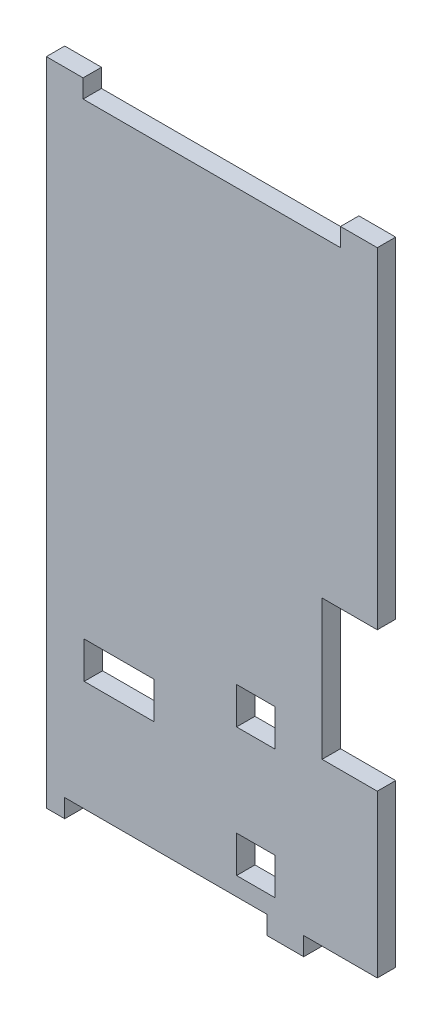
ISO-10303-21;
HEADER;
FILE_DESCRIPTION(('STEP AP214'),'2;1');
FILE_NAME('part.step','',(''),(''),'','','');
FILE_SCHEMA(('AUTOMOTIVE_DESIGN { 1 0 10303 214 1 1 1 1 }'));
ENDSEC;
DATA;
#1=APPLICATION_CONTEXT('core data for automotive mechanical design processes');
#2=APPLICATION_PROTOCOL_DEFINITION('international standard','automotive_design',2000,#1);
#3=PRODUCT_CONTEXT('',#1,'mechanical');
#4=PRODUCT('Part','Part','',(#3));
#5=PRODUCT_RELATED_PRODUCT_CATEGORY('part','',(#4));
#6=PRODUCT_DEFINITION_FORMATION('','',#4);
#7=PRODUCT_DEFINITION_CONTEXT('part definition',#1,'design');
#8=PRODUCT_DEFINITION('design','',#6,#7);
#9=PRODUCT_DEFINITION_SHAPE('','',#8);
#10=(LENGTH_UNIT() NAMED_UNIT(*) SI_UNIT(.MILLI.,.METRE.));
#11=(NAMED_UNIT(*) PLANE_ANGLE_UNIT() SI_UNIT($,.RADIAN.));
#12=(NAMED_UNIT(*) SI_UNIT($,.STERADIAN.) SOLID_ANGLE_UNIT());
#13=UNCERTAINTY_MEASURE_WITH_UNIT(LENGTH_MEASURE(1.E-05),#10,'distance_accuracy_value','');
#14=(GEOMETRIC_REPRESENTATION_CONTEXT(3) GLOBAL_UNCERTAINTY_ASSIGNED_CONTEXT((#13)) GLOBAL_UNIT_ASSIGNED_CONTEXT((#10,
#11,#12)) REPRESENTATION_CONTEXT('',''));
#15=CARTESIAN_POINT('',(0.,0.,0.));
#16=DIRECTION('',(0.,0.,1.));
#17=DIRECTION('',(1.,0.,0.));
#18=AXIS2_PLACEMENT_3D('',#15,#16,#17);
#19=CARTESIAN_POINT('',(0.,0.,5.));
#20=DIRECTION('',(0.,0.,1.));
#21=DIRECTION('',(1.,0.,0.));
#22=AXIS2_PLACEMENT_3D('',#19,#20,#21);
#23=PLANE('',#22);
#24=DIRECTION('',(1.,0.,0.));
#25=VECTOR('',#24,1.);
#26=CARTESIAN_POINT('',(51.7344095157548,5.00000000000664,5.));
#27=LINE('',#26,#25);
#28=CARTESIAN_POINT('',(51.7344095157548,5.00000000000664,5.));
#29=VERTEX_POINT('',#28);
#30=CARTESIAN_POINT('',(62.2002807221094,5.00000000000664,5.));
#31=VERTEX_POINT('',#30);
#32=EDGE_CURVE('E268',#29,#31,#27,.T.);
#33=ORIENTED_EDGE('',*,*,#32,.F.);
#34=DIRECTION('',(0.,-1.,0.));
#35=VECTOR('',#34,1.);
#36=CARTESIAN_POINT('',(51.7344095157548,15.0000000000066,5.));
#37=LINE('',#36,#35);
#38=CARTESIAN_POINT('',(51.7344095157548,15.0000000000066,5.));
#39=VERTEX_POINT('',#38);
#40=EDGE_CURVE('E266',#39,#29,#37,.T.);
#41=ORIENTED_EDGE('',*,*,#40,.F.);
#42=DIRECTION('',(-1.,0.,0.));
#43=VECTOR('',#42,1.);
#44=CARTESIAN_POINT('',(51.7344095157548,15.0000000000066,5.));
#45=LINE('',#44,#43);
#46=CARTESIAN_POINT('',(62.2002807221094,15.0000000000066,5.));
#47=VERTEX_POINT('',#46);
#48=EDGE_CURVE('E274',#47,#39,#45,.T.);
#49=ORIENTED_EDGE('',*,*,#48,.F.);
#50=DIRECTION('',(0.,1.,0.));
#51=VECTOR('',#50,1.);
#52=CARTESIAN_POINT('',(62.2002807221094,15.0000000000066,5.));
#53=LINE('',#52,#51);
#54=EDGE_CURVE('E271',#31,#47,#53,.T.);
#55=ORIENTED_EDGE('',*,*,#54,.F.);
#56=EDGE_LOOP('',(#33,#41,#49,#55));
#57=FACE_BOUND('',#56,.T.);
#58=DIRECTION('',(0.,-1.,0.));
#59=VECTOR('',#58,1.);
#60=CARTESIAN_POINT('',(0.,0.,5.));
#61=LINE('',#60,#59);
#62=CARTESIAN_POINT('',(0.,172.,5.));
#63=VERTEX_POINT('',#62);
#64=CARTESIAN_POINT('',(0.,-5.,5.));
#65=VERTEX_POINT('',#64);
#66=EDGE_CURVE('E328',#63,#65,#61,.T.);
#67=ORIENTED_EDGE('',*,*,#66,.T.);
#68=DIRECTION('',(1.,0.,0.));
#69=VECTOR('',#68,1.);
#70=CARTESIAN_POINT('',(0.,-5.,5.));
#71=LINE('',#70,#69);
#72=CARTESIAN_POINT('',(5.,-5.,5.));
#73=VERTEX_POINT('',#72);
#74=EDGE_CURVE('E331',#65,#73,#71,.T.);
#75=ORIENTED_EDGE('',*,*,#74,.T.);
#76=DIRECTION('',(0.,1.,0.));
#77=VECTOR('',#76,1.);
#78=CARTESIAN_POINT('',(5.,0.,5.));
#79=LINE('',#78,#77);
#80=CARTESIAN_POINT('',(5.,0.,5.));
#81=VERTEX_POINT('',#80);
#82=EDGE_CURVE('E334',#73,#81,#79,.T.);
#83=ORIENTED_EDGE('',*,*,#82,.T.);
#84=DIRECTION('',(1.,0.,0.));
#85=VECTOR('',#84,1.);
#86=CARTESIAN_POINT('',(5.,0.,5.));
#87=LINE('',#86,#85);
#88=CARTESIAN_POINT('',(60.,0.,5.));
#89=VERTEX_POINT('',#88);
#90=EDGE_CURVE('E336',#81,#89,#87,.T.);
#91=ORIENTED_EDGE('',*,*,#90,.T.);
#92=DIRECTION('',(0.,-1.,0.));
#93=VECTOR('',#92,1.);
#94=CARTESIAN_POINT('',(60.,0.,5.));
#95=LINE('',#94,#93);
#96=CARTESIAN_POINT('',(60.,-5.,5.));
#97=VERTEX_POINT('',#96);
#98=EDGE_CURVE('E338',#89,#97,#95,.T.);
#99=ORIENTED_EDGE('',*,*,#98,.T.);
#100=DIRECTION('',(1.,0.,0.));
#101=VECTOR('',#100,1.);
#102=CARTESIAN_POINT('',(60.,-5.,5.));
#103=LINE('',#102,#101);
#104=CARTESIAN_POINT('',(70.,-5.,5.));
#105=VERTEX_POINT('',#104);
#106=EDGE_CURVE('E340',#97,#105,#103,.T.);
#107=ORIENTED_EDGE('',*,*,#106,.T.);
#108=DIRECTION('',(0.,1.,0.));
#109=VECTOR('',#108,1.);
#110=CARTESIAN_POINT('',(70.,0.,5.));
#111=LINE('',#110,#109);
#112=CARTESIAN_POINT('',(70.,0.,5.));
#113=VERTEX_POINT('',#112);
#114=EDGE_CURVE('E342',#105,#113,#111,.T.);
#115=ORIENTED_EDGE('',*,*,#114,.T.);
#116=DIRECTION('',(1.,0.,0.));
#117=VECTOR('',#116,1.);
#118=CARTESIAN_POINT('',(70.,0.,5.));
#119=LINE('',#118,#117);
#120=CARTESIAN_POINT('',(90.,0.,5.));
#121=VERTEX_POINT('',#120);
#122=EDGE_CURVE('E344',#113,#121,#119,.T.);
#123=ORIENTED_EDGE('',*,*,#122,.T.);
#124=DIRECTION('',(0.,1.,0.));
#125=VECTOR('',#124,1.);
#126=CARTESIAN_POINT('',(90.,0.,5.));
#127=LINE('',#126,#125);
#128=CARTESIAN_POINT('',(90.,44.,5.));
#129=VERTEX_POINT('',#128);
#130=EDGE_CURVE('E346',#121,#129,#127,.T.);
#131=ORIENTED_EDGE('',*,*,#130,.T.);
#132=DIRECTION('',(-1.,0.,0.));
#133=VECTOR('',#132,1.);
#134=CARTESIAN_POINT('',(90.,44.,5.));
#135=LINE('',#134,#133);
#136=CARTESIAN_POINT('',(75.,44.,5.));
#137=VERTEX_POINT('',#136);
#138=EDGE_CURVE('E348',#129,#137,#135,.T.);
#139=ORIENTED_EDGE('',*,*,#138,.T.);
#140=DIRECTION('',(0.,1.,0.));
#141=VECTOR('',#140,1.);
#142=CARTESIAN_POINT('',(75.,82.,5.));
#143=LINE('',#142,#141);
#144=CARTESIAN_POINT('',(75.,82.,5.));
#145=VERTEX_POINT('',#144);
#146=EDGE_CURVE('E350',#137,#145,#143,.T.);
#147=ORIENTED_EDGE('',*,*,#146,.T.);
#148=DIRECTION('',(1.,0.,0.));
#149=VECTOR('',#148,1.);
#150=CARTESIAN_POINT('',(90.,82.,5.));
#151=LINE('',#150,#149);
#152=CARTESIAN_POINT('',(90.,82.,5.));
#153=VERTEX_POINT('',#152);
#154=EDGE_CURVE('E352',#145,#153,#151,.T.);
#155=ORIENTED_EDGE('',*,*,#154,.T.);
#156=DIRECTION('',(0.,1.,0.));
#157=VECTOR('',#156,1.);
#158=CARTESIAN_POINT('',(90.,82.,5.));
#159=LINE('',#158,#157);
#160=CARTESIAN_POINT('',(90.,172.,5.));
#161=VERTEX_POINT('',#160);
#162=EDGE_CURVE('E354',#153,#161,#159,.T.);
#163=ORIENTED_EDGE('',*,*,#162,.T.);
#164=DIRECTION('',(-1.,0.,0.));
#165=VECTOR('',#164,1.);
#166=CARTESIAN_POINT('',(90.,172.,5.));
#167=LINE('',#166,#165);
#168=CARTESIAN_POINT('',(80.,172.,5.));
#169=VERTEX_POINT('',#168);
#170=EDGE_CURVE('E356',#161,#169,#167,.T.);
#171=ORIENTED_EDGE('',*,*,#170,.T.);
#172=DIRECTION('',(0.,-1.,0.));
#173=VECTOR('',#172,1.);
#174=CARTESIAN_POINT('',(80.,167.,5.));
#175=LINE('',#174,#173);
#176=CARTESIAN_POINT('',(80.,167.,5.));
#177=VERTEX_POINT('',#176);
#178=EDGE_CURVE('E358',#169,#177,#175,.T.);
#179=ORIENTED_EDGE('',*,*,#178,.T.);
#180=DIRECTION('',(-1.,0.,0.));
#181=VECTOR('',#180,1.);
#182=CARTESIAN_POINT('',(10.,167.,5.));
#183=LINE('',#182,#181);
#184=CARTESIAN_POINT('',(10.,167.,5.));
#185=VERTEX_POINT('',#184);
#186=EDGE_CURVE('E360',#177,#185,#183,.T.);
#187=ORIENTED_EDGE('',*,*,#186,.T.);
#188=DIRECTION('',(0.,1.,0.));
#189=VECTOR('',#188,1.);
#190=CARTESIAN_POINT('',(10.,167.,5.));
#191=LINE('',#190,#189);
#192=CARTESIAN_POINT('',(10.,172.,5.));
#193=VERTEX_POINT('',#192);
#194=EDGE_CURVE('E362',#185,#193,#191,.T.);
#195=ORIENTED_EDGE('',*,*,#194,.T.);
#196=DIRECTION('',(-1.,0.,0.));
#197=VECTOR('',#196,1.);
#198=CARTESIAN_POINT('',(0.,172.,5.));
#199=LINE('',#198,#197);
#200=EDGE_CURVE('E364',#193,#63,#199,.T.);
#201=ORIENTED_EDGE('',*,*,#200,.T.);
#202=EDGE_LOOP('',(#67,#75,#83,#91,#99,#107,#115,#123,#131,#139,#147,#155,#163,#171,#179,#187,
#195,#201));
#203=FACE_BOUND('',#202,.T.);
#204=DIRECTION('',(1.,0.,0.));
#205=VECTOR('',#204,1.);
#206=CARTESIAN_POINT('',(51.7344095157548,40.0000000000066,5.));
#207=LINE('',#206,#205);
#208=CARTESIAN_POINT('',(51.7344095157548,40.0000000000066,5.));
#209=VERTEX_POINT('',#208);
#210=CARTESIAN_POINT('',(62.2002807221094,40.0000000000066,5.));
#211=VERTEX_POINT('',#210);
#212=EDGE_CURVE('E299',#209,#211,#207,.T.);
#213=ORIENTED_EDGE('',*,*,#212,.F.);
#214=DIRECTION('',(0.,-1.,0.));
#215=VECTOR('',#214,1.);
#216=CARTESIAN_POINT('',(51.7344095157548,50.0000000000067,5.));
#217=LINE('',#216,#215);
#218=CARTESIAN_POINT('',(51.7344095157548,50.0000000000067,5.));
#219=VERTEX_POINT('',#218);
#220=EDGE_CURVE('E297',#219,#209,#217,.T.);
#221=ORIENTED_EDGE('',*,*,#220,.F.);
#222=DIRECTION('',(-1.,0.,0.));
#223=VECTOR('',#222,1.);
#224=CARTESIAN_POINT('',(51.7344095157548,50.0000000000067,5.));
#225=LINE('',#224,#223);
#226=CARTESIAN_POINT('',(62.2002807221094,50.0000000000067,5.));
#227=VERTEX_POINT('',#226);
#228=EDGE_CURVE('E305',#227,#219,#225,.T.);
#229=ORIENTED_EDGE('',*,*,#228,.F.);
#230=DIRECTION('',(0.,1.,0.));
#231=VECTOR('',#230,1.);
#232=CARTESIAN_POINT('',(62.2002807221094,50.0000000000067,5.));
#233=LINE('',#232,#231);
#234=EDGE_CURVE('E302',#211,#227,#233,.T.);
#235=ORIENTED_EDGE('',*,*,#234,.F.);
#236=EDGE_LOOP('',(#213,#221,#229,#235));
#237=FACE_BOUND('',#236,.T.);
#238=DIRECTION('',(-1.,0.,0.));
#239=VECTOR('',#238,1.);
#240=CARTESIAN_POINT('',(29.3072899526297,40.,5.));
#241=LINE('',#240,#239);
#242=CARTESIAN_POINT('',(29.3072899526297,40.,5.));
#243=VERTEX_POINT('',#242);
#244=CARTESIAN_POINT('',(10.2916743036235,40.,5.));
#245=VERTEX_POINT('',#244);
#246=EDGE_CURVE('E238',#243,#245,#241,.T.);
#247=ORIENTED_EDGE('',*,*,#246,.F.);
#248=DIRECTION('',(0.,1.,0.));
#249=VECTOR('',#248,1.);
#250=CARTESIAN_POINT('',(29.3072899526297,40.,5.));
#251=LINE('',#250,#249);
#252=CARTESIAN_POINT('',(29.3072899526297,30.,5.));
#253=VERTEX_POINT('',#252);
#254=EDGE_CURVE('E230',#253,#243,#251,.T.);
#255=ORIENTED_EDGE('',*,*,#254,.F.);
#256=DIRECTION('',(1.,0.,0.));
#257=VECTOR('',#256,1.);
#258=CARTESIAN_POINT('',(29.3072899526297,30.,5.));
#259=LINE('',#258,#257);
#260=CARTESIAN_POINT('',(10.2916743036235,30.,5.));
#261=VERTEX_POINT('',#260);
#262=EDGE_CURVE('E252',#261,#253,#259,.T.);
#263=ORIENTED_EDGE('',*,*,#262,.F.);
#264=DIRECTION('',(0.,-1.,0.));
#265=VECTOR('',#264,1.);
#266=CARTESIAN_POINT('',(10.2916743036235,40.,5.));
#267=LINE('',#266,#265);
#268=EDGE_CURVE('E250',#245,#261,#267,.T.);
#269=ORIENTED_EDGE('',*,*,#268,.F.);
#270=EDGE_LOOP('',(#247,#255,#263,#269));
#271=FACE_BOUND('',#270,.T.);
#272=ADVANCED_FACE('F33',(#57,#203,#237,#271),#23,.T.);
#273=CARTESIAN_POINT('',(0.,0.,0.));
#274=DIRECTION('',(0.,0.,1.));
#275=DIRECTION('',(1.,0.,0.));
#276=AXIS2_PLACEMENT_3D('',#273,#274,#275);
#277=PLANE('',#276);
#278=DIRECTION('',(0.,-1.,0.));
#279=VECTOR('',#278,1.);
#280=CARTESIAN_POINT('',(51.7344095157548,15.0000000000066,0.));
#281=LINE('',#280,#279);
#282=CARTESIAN_POINT('',(51.7344095157548,15.0000000000066,0.));
#283=VERTEX_POINT('',#282);
#284=CARTESIAN_POINT('',(51.7344095157548,5.00000000000664,0.));
#285=VERTEX_POINT('',#284);
#286=EDGE_CURVE('E246',#283,#285,#281,.T.);
#287=ORIENTED_EDGE('',*,*,#286,.T.);
#288=DIRECTION('',(1.,0.,0.));
#289=VECTOR('',#288,1.);
#290=CARTESIAN_POINT('',(51.7344095157548,5.00000000000664,0.));
#291=LINE('',#290,#289);
#292=CARTESIAN_POINT('',(62.2002807221094,5.00000000000664,0.));
#293=VERTEX_POINT('',#292);
#294=EDGE_CURVE('E279',#285,#293,#291,.T.);
#295=ORIENTED_EDGE('',*,*,#294,.T.);
#296=DIRECTION('',(0.,1.,0.));
#297=VECTOR('',#296,1.);
#298=CARTESIAN_POINT('',(62.2002807221094,15.0000000000066,0.));
#299=LINE('',#298,#297);
#300=CARTESIAN_POINT('',(62.2002807221094,15.0000000000066,0.));
#301=VERTEX_POINT('',#300);
#302=EDGE_CURVE('E282',#293,#301,#299,.T.);
#303=ORIENTED_EDGE('',*,*,#302,.T.);
#304=DIRECTION('',(-1.,0.,0.));
#305=VECTOR('',#304,1.);
#306=CARTESIAN_POINT('',(51.7344095157548,15.0000000000066,0.));
#307=LINE('',#306,#305);
#308=EDGE_CURVE('E269',#301,#283,#307,.T.);
#309=ORIENTED_EDGE('',*,*,#308,.T.);
#310=EDGE_LOOP('',(#287,#295,#303,#309));
#311=FACE_BOUND('',#310,.T.);
#312=DIRECTION('',(1.,0.,0.));
#313=VECTOR('',#312,1.);
#314=CARTESIAN_POINT('',(0.,-5.,0.));
#315=LINE('',#314,#313);
#316=CARTESIAN_POINT('',(0.,-5.,0.));
#317=VERTEX_POINT('',#316);
#318=CARTESIAN_POINT('',(5.,-5.,0.));
#319=VERTEX_POINT('',#318);
#320=EDGE_CURVE('E327',#317,#319,#315,.T.);
#321=ORIENTED_EDGE('',*,*,#320,.F.);
#322=DIRECTION('',(0.,-1.,0.));
#323=VECTOR('',#322,1.);
#324=CARTESIAN_POINT('',(0.,0.,0.));
#325=LINE('',#324,#323);
#326=CARTESIAN_POINT('',(0.,172.,0.));
#327=VERTEX_POINT('',#326);
#328=EDGE_CURVE('E332',#327,#317,#325,.T.);
#329=ORIENTED_EDGE('',*,*,#328,.F.);
#330=DIRECTION('',(-1.,0.,0.));
#331=VECTOR('',#330,1.);
#332=CARTESIAN_POINT('',(0.,172.,0.));
#333=LINE('',#332,#331);
#334=CARTESIAN_POINT('',(10.,172.,0.));
#335=VERTEX_POINT('',#334);
#336=EDGE_CURVE('E400',#335,#327,#333,.T.);
#337=ORIENTED_EDGE('',*,*,#336,.F.);
#338=DIRECTION('',(0.,1.,0.));
#339=VECTOR('',#338,1.);
#340=CARTESIAN_POINT('',(10.,167.,0.));
#341=LINE('',#340,#339);
#342=CARTESIAN_POINT('',(10.,167.,0.));
#343=VERTEX_POINT('',#342);
#344=EDGE_CURVE('E398',#343,#335,#341,.T.);
#345=ORIENTED_EDGE('',*,*,#344,.F.);
#346=DIRECTION('',(-1.,0.,0.));
#347=VECTOR('',#346,1.);
#348=CARTESIAN_POINT('',(10.,167.,0.));
#349=LINE('',#348,#347);
#350=CARTESIAN_POINT('',(80.,167.,0.));
#351=VERTEX_POINT('',#350);
#352=EDGE_CURVE('E396',#351,#343,#349,.T.);
#353=ORIENTED_EDGE('',*,*,#352,.F.);
#354=DIRECTION('',(0.,-1.,0.));
#355=VECTOR('',#354,1.);
#356=CARTESIAN_POINT('',(80.,167.,0.));
#357=LINE('',#356,#355);
#358=CARTESIAN_POINT('',(80.,172.,0.));
#359=VERTEX_POINT('',#358);
#360=EDGE_CURVE('E394',#359,#351,#357,.T.);
#361=ORIENTED_EDGE('',*,*,#360,.F.);
#362=DIRECTION('',(-1.,0.,0.));
#363=VECTOR('',#362,1.);
#364=CARTESIAN_POINT('',(90.,172.,0.));
#365=LINE('',#364,#363);
#366=CARTESIAN_POINT('',(90.,172.,0.));
#367=VERTEX_POINT('',#366);
#368=EDGE_CURVE('E392',#367,#359,#365,.T.);
#369=ORIENTED_EDGE('',*,*,#368,.F.);
#370=DIRECTION('',(0.,1.,0.));
#371=VECTOR('',#370,1.);
#372=CARTESIAN_POINT('',(90.,167.,0.));
#373=LINE('',#372,#371);
#374=CARTESIAN_POINT('',(90.,82.,0.));
#375=VERTEX_POINT('',#374);
#376=EDGE_CURVE('E390',#375,#367,#373,.T.);
#377=ORIENTED_EDGE('',*,*,#376,.F.);
#378=DIRECTION('',(1.,0.,0.));
#379=VECTOR('',#378,1.);
#380=CARTESIAN_POINT('',(90.,82.,0.));
#381=LINE('',#380,#379);
#382=CARTESIAN_POINT('',(75.,82.,0.));
#383=VERTEX_POINT('',#382);
#384=EDGE_CURVE('E387',#383,#375,#381,.T.);
#385=ORIENTED_EDGE('',*,*,#384,.F.);
#386=DIRECTION('',(0.,1.,0.));
#387=VECTOR('',#386,1.);
#388=CARTESIAN_POINT('',(75.,82.,0.));
#389=LINE('',#388,#387);
#390=CARTESIAN_POINT('',(75.,44.,0.));
#391=VERTEX_POINT('',#390);
#392=EDGE_CURVE('E385',#391,#383,#389,.T.);
#393=ORIENTED_EDGE('',*,*,#392,.F.);
#394=DIRECTION('',(-1.,0.,0.));
#395=VECTOR('',#394,1.);
#396=CARTESIAN_POINT('',(90.,44.,0.));
#397=LINE('',#396,#395);
#398=CARTESIAN_POINT('',(90.,44.,0.));
#399=VERTEX_POINT('',#398);
#400=EDGE_CURVE('E383',#399,#391,#397,.T.);
#401=ORIENTED_EDGE('',*,*,#400,.F.);
#402=DIRECTION('',(0.,1.,0.));
#403=VECTOR('',#402,1.);
#404=CARTESIAN_POINT('',(90.,0.,0.));
#405=LINE('',#404,#403);
#406=CARTESIAN_POINT('',(90.,0.,0.));
#407=VERTEX_POINT('',#406);
#408=EDGE_CURVE('E381',#407,#399,#405,.T.);
#409=ORIENTED_EDGE('',*,*,#408,.F.);
#410=DIRECTION('',(1.,0.,0.));
#411=VECTOR('',#410,1.);
#412=CARTESIAN_POINT('',(70.,0.,0.));
#413=LINE('',#412,#411);
#414=CARTESIAN_POINT('',(70.,0.,0.));
#415=VERTEX_POINT('',#414);
#416=EDGE_CURVE('E379',#415,#407,#413,.T.);
#417=ORIENTED_EDGE('',*,*,#416,.F.);
#418=DIRECTION('',(0.,1.,0.));
#419=VECTOR('',#418,1.);
#420=CARTESIAN_POINT('',(70.,0.,0.));
#421=LINE('',#420,#419);
#422=CARTESIAN_POINT('',(70.,-5.,0.));
#423=VERTEX_POINT('',#422);
#424=EDGE_CURVE('E377',#423,#415,#421,.T.);
#425=ORIENTED_EDGE('',*,*,#424,.F.);
#426=DIRECTION('',(1.,0.,0.));
#427=VECTOR('',#426,1.);
#428=CARTESIAN_POINT('',(60.,-5.,0.));
#429=LINE('',#428,#427);
#430=CARTESIAN_POINT('',(60.,-5.,0.));
#431=VERTEX_POINT('',#430);
#432=EDGE_CURVE('E375',#431,#423,#429,.T.);
#433=ORIENTED_EDGE('',*,*,#432,.F.);
#434=DIRECTION('',(0.,-1.,0.));
#435=VECTOR('',#434,1.);
#436=CARTESIAN_POINT('',(60.,0.,0.));
#437=LINE('',#436,#435);
#438=CARTESIAN_POINT('',(60.,0.,0.));
#439=VERTEX_POINT('',#438);
#440=EDGE_CURVE('E373',#439,#431,#437,.T.);
#441=ORIENTED_EDGE('',*,*,#440,.F.);
#442=DIRECTION('',(1.,0.,0.));
#443=VECTOR('',#442,1.);
#444=CARTESIAN_POINT('',(5.,0.,0.));
#445=LINE('',#444,#443);
#446=CARTESIAN_POINT('',(5.,0.,0.));
#447=VERTEX_POINT('',#446);
#448=EDGE_CURVE('E371',#447,#439,#445,.T.);
#449=ORIENTED_EDGE('',*,*,#448,.F.);
#450=DIRECTION('',(0.,1.,0.));
#451=VECTOR('',#450,1.);
#452=CARTESIAN_POINT('',(5.,0.,0.));
#453=LINE('',#452,#451);
#454=EDGE_CURVE('E369',#319,#447,#453,.T.);
#455=ORIENTED_EDGE('',*,*,#454,.F.);
#456=EDGE_LOOP('',(#321,#329,#337,#345,#353,#361,#369,#377,#385,#393,#401,#409,#417,#425,#433,
#441,#449,#455));
#457=FACE_BOUND('',#456,.T.);
#458=DIRECTION('',(0.,-1.,0.));
#459=VECTOR('',#458,1.);
#460=CARTESIAN_POINT('',(51.7344095157548,50.0000000000067,0.));
#461=LINE('',#460,#459);
#462=CARTESIAN_POINT('',(51.7344095157548,50.0000000000067,0.));
#463=VERTEX_POINT('',#462);
#464=CARTESIAN_POINT('',(51.7344095157548,40.0000000000066,0.));
#465=VERTEX_POINT('',#464);
#466=EDGE_CURVE('E296',#463,#465,#461,.T.);
#467=ORIENTED_EDGE('',*,*,#466,.T.);
#468=DIRECTION('',(1.,0.,0.));
#469=VECTOR('',#468,1.);
#470=CARTESIAN_POINT('',(51.7344095157548,40.0000000000066,0.));
#471=LINE('',#470,#469);
#472=CARTESIAN_POINT('',(62.2002807221094,40.0000000000066,0.));
#473=VERTEX_POINT('',#472);
#474=EDGE_CURVE('E310',#465,#473,#471,.T.);
#475=ORIENTED_EDGE('',*,*,#474,.T.);
#476=DIRECTION('',(0.,1.,0.));
#477=VECTOR('',#476,1.);
#478=CARTESIAN_POINT('',(62.2002807221094,50.0000000000067,0.));
#479=LINE('',#478,#477);
#480=CARTESIAN_POINT('',(62.2002807221094,50.0000000000067,0.));
#481=VERTEX_POINT('',#480);
#482=EDGE_CURVE('E313',#473,#481,#479,.T.);
#483=ORIENTED_EDGE('',*,*,#482,.T.);
#484=DIRECTION('',(-1.,0.,0.));
#485=VECTOR('',#484,1.);
#486=CARTESIAN_POINT('',(51.7344095157548,50.0000000000067,0.));
#487=LINE('',#486,#485);
#488=EDGE_CURVE('E300',#481,#463,#487,.T.);
#489=ORIENTED_EDGE('',*,*,#488,.T.);
#490=EDGE_LOOP('',(#467,#475,#483,#489));
#491=FACE_BOUND('',#490,.T.);
#492=DIRECTION('',(0.,1.,0.));
#493=VECTOR('',#492,1.);
#494=CARTESIAN_POINT('',(29.3072899526297,40.,0.));
#495=LINE('',#494,#493);
#496=CARTESIAN_POINT('',(29.3072899526297,30.,0.));
#497=VERTEX_POINT('',#496);
#498=CARTESIAN_POINT('',(29.3072899526297,40.,0.));
#499=VERTEX_POINT('',#498);
#500=EDGE_CURVE('E56',#497,#499,#495,.T.);
#501=ORIENTED_EDGE('',*,*,#500,.T.);
#502=DIRECTION('',(-1.,0.,0.));
#503=VECTOR('',#502,1.);
#504=CARTESIAN_POINT('',(29.3072899526297,40.,0.));
#505=LINE('',#504,#503);
#506=CARTESIAN_POINT('',(10.2916743036235,40.,0.));
#507=VERTEX_POINT('',#506);
#508=EDGE_CURVE('E245',#499,#507,#505,.T.);
#509=ORIENTED_EDGE('',*,*,#508,.T.);
#510=DIRECTION('',(0.,-1.,0.));
#511=VECTOR('',#510,1.);
#512=CARTESIAN_POINT('',(10.2916743036235,40.,0.));
#513=LINE('',#512,#511);
#514=CARTESIAN_POINT('',(10.2916743036235,30.,0.));
#515=VERTEX_POINT('',#514);
#516=EDGE_CURVE('E258',#507,#515,#513,.T.);
#517=ORIENTED_EDGE('',*,*,#516,.T.);
#518=DIRECTION('',(1.,0.,0.));
#519=VECTOR('',#518,1.);
#520=CARTESIAN_POINT('',(29.3072899526297,30.,0.));
#521=LINE('',#520,#519);
#522=EDGE_CURVE('E239',#515,#497,#521,.T.);
#523=ORIENTED_EDGE('',*,*,#522,.T.);
#524=EDGE_LOOP('',(#501,#509,#517,#523));
#525=FACE_BOUND('',#524,.T.);
#526=ADVANCED_FACE('F461',(#311,#457,#491,#525),#277,.F.);
#527=CARTESIAN_POINT('',(0.,-5.,5.));
#528=DIRECTION('',(0.,1.,0.));
#529=DIRECTION('',(0.,0.,1.));
#530=AXIS2_PLACEMENT_3D('',#527,#528,#529);
#531=PLANE('',#530);
#532=ORIENTED_EDGE('',*,*,#320,.T.);
#533=DIRECTION('',(0.,0.,-1.));
#534=VECTOR('',#533,1.);
#535=CARTESIAN_POINT('',(5.,-5.,5.));
#536=LINE('',#535,#534);
#537=EDGE_CURVE('E41',#73,#319,#536,.T.);
#538=ORIENTED_EDGE('',*,*,#537,.F.);
#539=ORIENTED_EDGE('',*,*,#74,.F.);
#540=DIRECTION('',(0.,0.,-1.));
#541=VECTOR('',#540,1.);
#542=CARTESIAN_POINT('',(0.,-5.,5.));
#543=LINE('',#542,#541);
#544=EDGE_CURVE('E11',#65,#317,#543,.T.);
#545=ORIENTED_EDGE('',*,*,#544,.T.);
#546=EDGE_LOOP('',(#532,#538,#539,#545));
#547=FACE_BOUND('',#546,.T.);
#548=ADVANCED_FACE('F35',(#547),#531,.F.);
#549=CARTESIAN_POINT('',(5.,0.,5.));
#550=DIRECTION('',(-1.,0.,0.));
#551=DIRECTION('',(0.,-1.,0.));
#552=AXIS2_PLACEMENT_3D('',#549,#550,#551);
#553=PLANE('',#552);
#554=ORIENTED_EDGE('',*,*,#454,.T.);
#555=DIRECTION('',(0.,0.,-1.));
#556=VECTOR('',#555,1.);
#557=CARTESIAN_POINT('',(5.,0.,5.));
#558=LINE('',#557,#556);
#559=EDGE_CURVE('E448',#81,#447,#558,.T.);
#560=ORIENTED_EDGE('',*,*,#559,.F.);
#561=ORIENTED_EDGE('',*,*,#82,.F.);
#562=ORIENTED_EDGE('',*,*,#537,.T.);
#563=EDGE_LOOP('',(#554,#560,#561,#562));
#564=FACE_BOUND('',#563,.T.);
#565=ADVANCED_FACE('F455',(#564),#553,.F.);
#566=CARTESIAN_POINT('',(5.,0.,5.));
#567=DIRECTION('',(0.,1.,0.));
#568=DIRECTION('',(0.,0.,1.));
#569=AXIS2_PLACEMENT_3D('',#566,#567,#568);
#570=PLANE('',#569);
#571=ORIENTED_EDGE('',*,*,#448,.T.);
#572=DIRECTION('',(0.,0.,-1.));
#573=VECTOR('',#572,1.);
#574=CARTESIAN_POINT('',(60.,0.,5.));
#575=LINE('',#574,#573);
#576=EDGE_CURVE('E445',#89,#439,#575,.T.);
#577=ORIENTED_EDGE('',*,*,#576,.F.);
#578=ORIENTED_EDGE('',*,*,#90,.F.);
#579=ORIENTED_EDGE('',*,*,#559,.T.);
#580=EDGE_LOOP('',(#571,#577,#578,#579));
#581=FACE_BOUND('',#580,.T.);
#582=ADVANCED_FACE('F467',(#581),#570,.F.);
#583=CARTESIAN_POINT('',(60.,0.,5.));
#584=DIRECTION('',(1.,0.,0.));
#585=DIRECTION('',(0.,0.,-1.));
#586=AXIS2_PLACEMENT_3D('',#583,#584,#585);
#587=PLANE('',#586);
#588=ORIENTED_EDGE('',*,*,#440,.T.);
#589=DIRECTION('',(0.,0.,-1.));
#590=VECTOR('',#589,1.);
#591=CARTESIAN_POINT('',(60.,-5.,5.));
#592=LINE('',#591,#590);
#593=EDGE_CURVE('E442',#97,#431,#592,.T.);
#594=ORIENTED_EDGE('',*,*,#593,.F.);
#595=ORIENTED_EDGE('',*,*,#98,.F.);
#596=ORIENTED_EDGE('',*,*,#576,.T.);
#597=EDGE_LOOP('',(#588,#594,#595,#596));
#598=FACE_BOUND('',#597,.T.);
#599=ADVANCED_FACE('F471',(#598),#587,.F.);
#600=CARTESIAN_POINT('',(60.,-5.,5.));
#601=DIRECTION('',(0.,1.,0.));
#602=DIRECTION('',(-1.,0.,0.));
#603=AXIS2_PLACEMENT_3D('',#600,#601,#602);
#604=PLANE('',#603);
#605=ORIENTED_EDGE('',*,*,#432,.T.);
#606=DIRECTION('',(0.,0.,-1.));
#607=VECTOR('',#606,1.);
#608=CARTESIAN_POINT('',(70.,-5.,5.));
#609=LINE('',#608,#607);
#610=EDGE_CURVE('E439',#105,#423,#609,.T.);
#611=ORIENTED_EDGE('',*,*,#610,.F.);
#612=ORIENTED_EDGE('',*,*,#106,.F.);
#613=ORIENTED_EDGE('',*,*,#593,.T.);
#614=EDGE_LOOP('',(#605,#611,#612,#613));
#615=FACE_BOUND('',#614,.T.);
#616=ADVANCED_FACE('F540',(#615),#604,.F.);
#617=CARTESIAN_POINT('',(70.,0.,5.));
#618=DIRECTION('',(-1.,0.,0.));
#619=DIRECTION('',(0.,0.,1.));
#620=AXIS2_PLACEMENT_3D('',#617,#618,#619);
#621=PLANE('',#620);
#622=ORIENTED_EDGE('',*,*,#424,.T.);
#623=DIRECTION('',(0.,0.,-1.));
#624=VECTOR('',#623,1.);
#625=CARTESIAN_POINT('',(70.,0.,5.));
#626=LINE('',#625,#624);
#627=EDGE_CURVE('E436',#113,#415,#626,.T.);
#628=ORIENTED_EDGE('',*,*,#627,.F.);
#629=ORIENTED_EDGE('',*,*,#114,.F.);
#630=ORIENTED_EDGE('',*,*,#610,.T.);
#631=EDGE_LOOP('',(#622,#628,#629,#630));
#632=FACE_BOUND('',#631,.T.);
#633=ADVANCED_FACE('F537',(#632),#621,.F.);
#634=CARTESIAN_POINT('',(70.,0.,5.));
#635=DIRECTION('',(0.,1.,0.));
#636=DIRECTION('',(0.,0.,1.));
#637=AXIS2_PLACEMENT_3D('',#634,#635,#636);
#638=PLANE('',#637);
#639=ORIENTED_EDGE('',*,*,#416,.T.);
#640=DIRECTION('',(0.,0.,-1.));
#641=VECTOR('',#640,1.);
#642=CARTESIAN_POINT('',(90.,0.,5.));
#643=LINE('',#642,#641);
#644=EDGE_CURVE('E433',#121,#407,#643,.T.);
#645=ORIENTED_EDGE('',*,*,#644,.F.);
#646=ORIENTED_EDGE('',*,*,#122,.F.);
#647=ORIENTED_EDGE('',*,*,#627,.T.);
#648=EDGE_LOOP('',(#639,#645,#646,#647));
#649=FACE_BOUND('',#648,.T.);
#650=ADVANCED_FACE('F533',(#649),#638,.F.);
#651=CARTESIAN_POINT('',(90.,0.,5.));
#652=DIRECTION('',(-1.,0.,0.));
#653=DIRECTION('',(0.,0.,1.));
#654=AXIS2_PLACEMENT_3D('',#651,#652,#653);
#655=PLANE('',#654);
#656=ORIENTED_EDGE('',*,*,#408,.T.);
#657=DIRECTION('',(0.,0.,-1.));
#658=VECTOR('',#657,1.);
#659=CARTESIAN_POINT('',(90.,44.,5.));
#660=LINE('',#659,#658);
#661=EDGE_CURVE('E430',#129,#399,#660,.T.);
#662=ORIENTED_EDGE('',*,*,#661,.F.);
#663=ORIENTED_EDGE('',*,*,#130,.F.);
#664=ORIENTED_EDGE('',*,*,#644,.T.);
#665=EDGE_LOOP('',(#656,#662,#663,#664));
#666=FACE_BOUND('',#665,.T.);
#667=ADVANCED_FACE('F529',(#666),#655,.F.);
#668=CARTESIAN_POINT('',(90.,44.,5.));
#669=DIRECTION('',(0.,-1.,0.));
#670=DIRECTION('',(1.,0.,0.));
#671=AXIS2_PLACEMENT_3D('',#668,#669,#670);
#672=PLANE('',#671);
#673=ORIENTED_EDGE('',*,*,#400,.T.);
#674=DIRECTION('',(0.,0.,-1.));
#675=VECTOR('',#674,1.);
#676=CARTESIAN_POINT('',(75.,44.,5.));
#677=LINE('',#676,#675);
#678=EDGE_CURVE('E427',#137,#391,#677,.T.);
#679=ORIENTED_EDGE('',*,*,#678,.F.);
#680=ORIENTED_EDGE('',*,*,#138,.F.);
#681=ORIENTED_EDGE('',*,*,#661,.T.);
#682=EDGE_LOOP('',(#673,#679,#680,#681));
#683=FACE_BOUND('',#682,.T.);
#684=ADVANCED_FACE('F525',(#683),#672,.F.);
#685=CARTESIAN_POINT('',(75.,82.,5.));
#686=DIRECTION('',(-1.,0.,0.));
#687=DIRECTION('',(0.,-1.,0.));
#688=AXIS2_PLACEMENT_3D('',#685,#686,#687);
#689=PLANE('',#688);
#690=ORIENTED_EDGE('',*,*,#392,.T.);
#691=DIRECTION('',(0.,0.,-1.));
#692=VECTOR('',#691,1.);
#693=CARTESIAN_POINT('',(75.,82.,5.));
#694=LINE('',#693,#692);
#695=EDGE_CURVE('E424',#145,#383,#694,.T.);
#696=ORIENTED_EDGE('',*,*,#695,.F.);
#697=ORIENTED_EDGE('',*,*,#146,.F.);
#698=ORIENTED_EDGE('',*,*,#678,.T.);
#699=EDGE_LOOP('',(#690,#696,#697,#698));
#700=FACE_BOUND('',#699,.T.);
#701=ADVANCED_FACE('F520',(#700),#689,.F.);
#702=CARTESIAN_POINT('',(90.,82.,5.));
#703=DIRECTION('',(0.,1.,0.));
#704=DIRECTION('',(0.,0.,1.));
#705=AXIS2_PLACEMENT_3D('',#702,#703,#704);
#706=PLANE('',#705);
#707=ORIENTED_EDGE('',*,*,#384,.T.);
#708=DIRECTION('',(0.,0.,-1.));
#709=VECTOR('',#708,1.);
#710=CARTESIAN_POINT('',(90.,82.,5.));
#711=LINE('',#710,#709);
#712=EDGE_CURVE('E421',#153,#375,#711,.T.);
#713=ORIENTED_EDGE('',*,*,#712,.F.);
#714=ORIENTED_EDGE('',*,*,#154,.F.);
#715=ORIENTED_EDGE('',*,*,#695,.T.);
#716=EDGE_LOOP('',(#707,#713,#714,#715));
#717=FACE_BOUND('',#716,.T.);
#718=ADVANCED_FACE('F511',(#717),#706,.F.);
#719=CARTESIAN_POINT('',(90.,167.,5.));
#720=DIRECTION('',(-1.,0.,0.));
#721=DIRECTION('',(0.,0.,1.));
#722=AXIS2_PLACEMENT_3D('',#719,#720,#721);
#723=PLANE('',#722);
#724=ORIENTED_EDGE('',*,*,#376,.T.);
#725=DIRECTION('',(0.,0.,-1.));
#726=VECTOR('',#725,1.);
#727=CARTESIAN_POINT('',(90.,172.,5.));
#728=LINE('',#727,#726);
#729=EDGE_CURVE('E418',#161,#367,#728,.T.);
#730=ORIENTED_EDGE('',*,*,#729,.F.);
#731=ORIENTED_EDGE('',*,*,#162,.F.);
#732=ORIENTED_EDGE('',*,*,#712,.T.);
#733=EDGE_LOOP('',(#724,#730,#731,#732));
#734=FACE_BOUND('',#733,.T.);
#735=ADVANCED_FACE('F515',(#734),#723,.F.);
#736=CARTESIAN_POINT('',(90.,172.,5.));
#737=DIRECTION('',(0.,-1.,0.));
#738=DIRECTION('',(0.,0.,-1.));
#739=AXIS2_PLACEMENT_3D('',#736,#737,#738);
#740=PLANE('',#739);
#741=ORIENTED_EDGE('',*,*,#368,.T.);
#742=DIRECTION('',(0.,0.,-1.));
#743=VECTOR('',#742,1.);
#744=CARTESIAN_POINT('',(80.,172.,5.));
#745=LINE('',#744,#743);
#746=EDGE_CURVE('E415',#169,#359,#745,.T.);
#747=ORIENTED_EDGE('',*,*,#746,.F.);
#748=ORIENTED_EDGE('',*,*,#170,.F.);
#749=ORIENTED_EDGE('',*,*,#729,.T.);
#750=EDGE_LOOP('',(#741,#747,#748,#749));
#751=FACE_BOUND('',#750,.T.);
#752=ADVANCED_FACE('F504',(#751),#740,.F.);
#753=CARTESIAN_POINT('',(80.,167.,5.));
#754=DIRECTION('',(1.,0.,0.));
#755=DIRECTION('',(0.,0.,-1.));
#756=AXIS2_PLACEMENT_3D('',#753,#754,#755);
#757=PLANE('',#756);
#758=ORIENTED_EDGE('',*,*,#360,.T.);
#759=DIRECTION('',(0.,0.,-1.));
#760=VECTOR('',#759,1.);
#761=CARTESIAN_POINT('',(80.,167.,5.));
#762=LINE('',#761,#760);
#763=EDGE_CURVE('E412',#177,#351,#762,.T.);
#764=ORIENTED_EDGE('',*,*,#763,.F.);
#765=ORIENTED_EDGE('',*,*,#178,.F.);
#766=ORIENTED_EDGE('',*,*,#746,.T.);
#767=EDGE_LOOP('',(#758,#764,#765,#766));
#768=FACE_BOUND('',#767,.T.);
#769=ADVANCED_FACE('F500',(#768),#757,.F.);
#770=CARTESIAN_POINT('',(10.,167.,5.));
#771=DIRECTION('',(0.,-1.,0.));
#772=DIRECTION('',(0.,0.,-1.));
#773=AXIS2_PLACEMENT_3D('',#770,#771,#772);
#774=PLANE('',#773);
#775=ORIENTED_EDGE('',*,*,#352,.T.);
#776=DIRECTION('',(0.,0.,-1.));
#777=VECTOR('',#776,1.);
#778=CARTESIAN_POINT('',(10.,167.,5.));
#779=LINE('',#778,#777);
#780=EDGE_CURVE('E409',#185,#343,#779,.T.);
#781=ORIENTED_EDGE('',*,*,#780,.F.);
#782=ORIENTED_EDGE('',*,*,#186,.F.);
#783=ORIENTED_EDGE('',*,*,#763,.T.);
#784=EDGE_LOOP('',(#775,#781,#782,#783));
#785=FACE_BOUND('',#784,.T.);
#786=ADVANCED_FACE('F495',(#785),#774,.F.);
#787=CARTESIAN_POINT('',(10.,167.,5.));
#788=DIRECTION('',(-1.,0.,0.));
#789=DIRECTION('',(0.,0.,1.));
#790=AXIS2_PLACEMENT_3D('',#787,#788,#789);
#791=PLANE('',#790);
#792=ORIENTED_EDGE('',*,*,#344,.T.);
#793=DIRECTION('',(0.,0.,-1.));
#794=VECTOR('',#793,1.);
#795=CARTESIAN_POINT('',(10.,172.,5.));
#796=LINE('',#795,#794);
#797=EDGE_CURVE('E406',#193,#335,#796,.T.);
#798=ORIENTED_EDGE('',*,*,#797,.F.);
#799=ORIENTED_EDGE('',*,*,#194,.F.);
#800=ORIENTED_EDGE('',*,*,#780,.T.);
#801=EDGE_LOOP('',(#792,#798,#799,#800));
#802=FACE_BOUND('',#801,.T.);
#803=ADVANCED_FACE('F489',(#802),#791,.F.);
#804=CARTESIAN_POINT('',(0.,172.,5.));
#805=DIRECTION('',(0.,-1.,0.));
#806=DIRECTION('',(0.,0.,-1.));
#807=AXIS2_PLACEMENT_3D('',#804,#805,#806);
#808=PLANE('',#807);
#809=ORIENTED_EDGE('',*,*,#336,.T.);
#810=DIRECTION('',(0.,0.,-1.));
#811=VECTOR('',#810,1.);
#812=CARTESIAN_POINT('',(0.,172.,5.));
#813=LINE('',#812,#811);
#814=EDGE_CURVE('E367',#63,#327,#813,.T.);
#815=ORIENTED_EDGE('',*,*,#814,.F.);
#816=ORIENTED_EDGE('',*,*,#200,.F.);
#817=ORIENTED_EDGE('',*,*,#797,.T.);
#818=EDGE_LOOP('',(#809,#815,#816,#817));
#819=FACE_BOUND('',#818,.T.);
#820=ADVANCED_FACE('F484',(#819),#808,.F.);
#821=CARTESIAN_POINT('',(0.,0.,5.));
#822=DIRECTION('',(1.,0.,0.));
#823=DIRECTION('',(0.,0.,-1.));
#824=AXIS2_PLACEMENT_3D('',#821,#822,#823);
#825=PLANE('',#824);
#826=ORIENTED_EDGE('',*,*,#328,.T.);
#827=ORIENTED_EDGE('',*,*,#544,.F.);
#828=ORIENTED_EDGE('',*,*,#66,.F.);
#829=ORIENTED_EDGE('',*,*,#814,.T.);
#830=EDGE_LOOP('',(#826,#827,#828,#829));
#831=FACE_BOUND('',#830,.T.);
#832=ADVANCED_FACE('F479',(#831),#825,.F.);
#833=CARTESIAN_POINT('',(51.7344095157548,50.0000000000067,5.));
#834=DIRECTION('',(1.,0.,0.));
#835=DIRECTION('',(0.,0.,-1.));
#836=AXIS2_PLACEMENT_3D('',#833,#834,#835);
#837=PLANE('',#836);
#838=ORIENTED_EDGE('',*,*,#466,.F.);
#839=DIRECTION('',(0.,0.,-1.));
#840=VECTOR('',#839,1.);
#841=CARTESIAN_POINT('',(51.7344095157548,50.0000000000067,5.));
#842=LINE('',#841,#840);
#843=EDGE_CURVE('E307',#219,#463,#842,.T.);
#844=ORIENTED_EDGE('',*,*,#843,.F.);
#845=ORIENTED_EDGE('',*,*,#220,.T.);
#846=DIRECTION('',(0.,0.,-1.));
#847=VECTOR('',#846,1.);
#848=CARTESIAN_POINT('',(51.7344095157548,40.0000000000066,5.));
#849=LINE('',#848,#847);
#850=EDGE_CURVE('E324',#209,#465,#849,.T.);
#851=ORIENTED_EDGE('',*,*,#850,.T.);
#852=EDGE_LOOP('',(#838,#844,#845,#851));
#853=FACE_BOUND('',#852,.T.);
#854=ADVANCED_FACE('F559',(#853),#837,.T.);
#855=CARTESIAN_POINT('',(51.7344095157548,40.0000000000066,5.));
#856=DIRECTION('',(0.,1.,0.));
#857=DIRECTION('',(0.,0.,1.));
#858=AXIS2_PLACEMENT_3D('',#855,#856,#857);
#859=PLANE('',#858);
#860=ORIENTED_EDGE('',*,*,#474,.F.);
#861=ORIENTED_EDGE('',*,*,#850,.F.);
#862=ORIENTED_EDGE('',*,*,#212,.T.);
#863=DIRECTION('',(0.,0.,-1.));
#864=VECTOR('',#863,1.);
#865=CARTESIAN_POINT('',(62.2002807221094,40.0000000000066,5.));
#866=LINE('',#865,#864);
#867=EDGE_CURVE('E322',#211,#473,#866,.T.);
#868=ORIENTED_EDGE('',*,*,#867,.T.);
#869=EDGE_LOOP('',(#860,#861,#862,#868));
#870=FACE_BOUND('',#869,.T.);
#871=ADVANCED_FACE('F639',(#870),#859,.T.);
#872=CARTESIAN_POINT('',(62.2002807221094,50.0000000000067,5.));
#873=DIRECTION('',(-1.,0.,0.));
#874=DIRECTION('',(0.,-1.,0.));
#875=AXIS2_PLACEMENT_3D('',#872,#873,#874);
#876=PLANE('',#875);
#877=ORIENTED_EDGE('',*,*,#482,.F.);
#878=ORIENTED_EDGE('',*,*,#867,.F.);
#879=ORIENTED_EDGE('',*,*,#234,.T.);
#880=DIRECTION('',(0.,0.,-1.));
#881=VECTOR('',#880,1.);
#882=CARTESIAN_POINT('',(62.2002807221094,50.0000000000067,5.));
#883=LINE('',#882,#881);
#884=EDGE_CURVE('E320',#227,#481,#883,.T.);
#885=ORIENTED_EDGE('',*,*,#884,.T.);
#886=EDGE_LOOP('',(#877,#878,#879,#885));
#887=FACE_BOUND('',#886,.T.);
#888=ADVANCED_FACE('F646',(#887),#876,.T.);
#889=CARTESIAN_POINT('',(51.7344095157548,50.0000000000067,5.));
#890=DIRECTION('',(0.,-1.,0.));
#891=DIRECTION('',(0.,0.,-1.));
#892=AXIS2_PLACEMENT_3D('',#889,#890,#891);
#893=PLANE('',#892);
#894=ORIENTED_EDGE('',*,*,#488,.F.);
#895=ORIENTED_EDGE('',*,*,#884,.F.);
#896=ORIENTED_EDGE('',*,*,#228,.T.);
#897=ORIENTED_EDGE('',*,*,#843,.T.);
#898=EDGE_LOOP('',(#894,#895,#896,#897));
#899=FACE_BOUND('',#898,.T.);
#900=ADVANCED_FACE('F653',(#899),#893,.T.);
#901=CARTESIAN_POINT('',(51.7344095157548,15.0000000000066,5.));
#902=DIRECTION('',(1.,0.,0.));
#903=DIRECTION('',(0.,0.,-1.));
#904=AXIS2_PLACEMENT_3D('',#901,#902,#903);
#905=PLANE('',#904);
#906=ORIENTED_EDGE('',*,*,#286,.F.);
#907=DIRECTION('',(0.,0.,-1.));
#908=VECTOR('',#907,1.);
#909=CARTESIAN_POINT('',(51.7344095157548,15.0000000000066,5.));
#910=LINE('',#909,#908);
#911=EDGE_CURVE('E276',#39,#283,#910,.T.);
#912=ORIENTED_EDGE('',*,*,#911,.F.);
#913=ORIENTED_EDGE('',*,*,#40,.T.);
#914=DIRECTION('',(0.,0.,-1.));
#915=VECTOR('',#914,1.);
#916=CARTESIAN_POINT('',(51.7344095157548,5.00000000000664,5.));
#917=LINE('',#916,#915);
#918=EDGE_CURVE('E293',#29,#285,#917,.T.);
#919=ORIENTED_EDGE('',*,*,#918,.T.);
#920=EDGE_LOOP('',(#906,#912,#913,#919));
#921=FACE_BOUND('',#920,.T.);
#922=ADVANCED_FACE('F661',(#921),#905,.T.);
#923=CARTESIAN_POINT('',(51.7344095157548,5.00000000000664,5.));
#924=DIRECTION('',(0.,1.,0.));
#925=DIRECTION('',(0.,0.,1.));
#926=AXIS2_PLACEMENT_3D('',#923,#924,#925);
#927=PLANE('',#926);
#928=ORIENTED_EDGE('',*,*,#294,.F.);
#929=ORIENTED_EDGE('',*,*,#918,.F.);
#930=ORIENTED_EDGE('',*,*,#32,.T.);
#931=DIRECTION('',(0.,0.,-1.));
#932=VECTOR('',#931,1.);
#933=CARTESIAN_POINT('',(62.2002807221094,5.00000000000664,5.));
#934=LINE('',#933,#932);
#935=EDGE_CURVE('E291',#31,#293,#934,.T.);
#936=ORIENTED_EDGE('',*,*,#935,.T.);
#937=EDGE_LOOP('',(#928,#929,#930,#936));
#938=FACE_BOUND('',#937,.T.);
#939=ADVANCED_FACE('F669',(#938),#927,.T.);
#940=CARTESIAN_POINT('',(62.2002807221094,15.0000000000066,5.));
#941=DIRECTION('',(-1.,0.,0.));
#942=DIRECTION('',(0.,0.,1.));
#943=AXIS2_PLACEMENT_3D('',#940,#941,#942);
#944=PLANE('',#943);
#945=ORIENTED_EDGE('',*,*,#302,.F.);
#946=ORIENTED_EDGE('',*,*,#935,.F.);
#947=ORIENTED_EDGE('',*,*,#54,.T.);
#948=DIRECTION('',(0.,0.,-1.));
#949=VECTOR('',#948,1.);
#950=CARTESIAN_POINT('',(62.2002807221094,15.0000000000066,5.));
#951=LINE('',#950,#949);
#952=EDGE_CURVE('E289',#47,#301,#951,.T.);
#953=ORIENTED_EDGE('',*,*,#952,.T.);
#954=EDGE_LOOP('',(#945,#946,#947,#953));
#955=FACE_BOUND('',#954,.T.);
#956=ADVANCED_FACE('F677',(#955),#944,.T.);
#957=CARTESIAN_POINT('',(51.7344095157548,15.0000000000066,5.));
#958=DIRECTION('',(0.,-1.,0.));
#959=DIRECTION('',(1.,0.,0.));
#960=AXIS2_PLACEMENT_3D('',#957,#958,#959);
#961=PLANE('',#960);
#962=ORIENTED_EDGE('',*,*,#308,.F.);
#963=ORIENTED_EDGE('',*,*,#952,.F.);
#964=ORIENTED_EDGE('',*,*,#48,.T.);
#965=ORIENTED_EDGE('',*,*,#911,.T.);
#966=EDGE_LOOP('',(#962,#963,#964,#965));
#967=FACE_BOUND('',#966,.T.);
#968=ADVANCED_FACE('F685',(#967),#961,.T.);
#969=CARTESIAN_POINT('',(29.3072899526297,40.,5.));
#970=DIRECTION('',(-1.,0.,0.));
#971=DIRECTION('',(0.,-1.,0.));
#972=AXIS2_PLACEMENT_3D('',#969,#970,#971);
#973=PLANE('',#972);
#974=ORIENTED_EDGE('',*,*,#500,.F.);
#975=DIRECTION('',(0.,0.,-1.));
#976=VECTOR('',#975,1.);
#977=CARTESIAN_POINT('',(29.3072899526297,30.,5.));
#978=LINE('',#977,#976);
#979=EDGE_CURVE('E234',#253,#497,#978,.T.);
#980=ORIENTED_EDGE('',*,*,#979,.F.);
#981=ORIENTED_EDGE('',*,*,#254,.T.);
#982=DIRECTION('',(0.,0.,-1.));
#983=VECTOR('',#982,1.);
#984=CARTESIAN_POINT('',(29.3072899526297,40.,5.));
#985=LINE('',#984,#983);
#986=EDGE_CURVE('E233',#243,#499,#985,.T.);
#987=ORIENTED_EDGE('',*,*,#986,.T.);
#988=EDGE_LOOP('',(#974,#980,#981,#987));
#989=FACE_BOUND('',#988,.T.);
#990=ADVANCED_FACE('F232',(#989),#973,.T.);
#991=CARTESIAN_POINT('',(29.3072899526297,40.,5.));
#992=DIRECTION('',(0.,-1.,0.));
#993=DIRECTION('',(0.,0.,-1.));
#994=AXIS2_PLACEMENT_3D('',#991,#992,#993);
#995=PLANE('',#994);
#996=ORIENTED_EDGE('',*,*,#508,.F.);
#997=ORIENTED_EDGE('',*,*,#986,.F.);
#998=ORIENTED_EDGE('',*,*,#246,.T.);
#999=DIRECTION('',(0.,0.,-1.));
#1000=VECTOR('',#999,1.);
#1001=CARTESIAN_POINT('',(10.2916743036235,40.,5.));
#1002=LINE('',#1001,#1000);
#1003=EDGE_CURVE('E247',#245,#507,#1002,.T.);
#1004=ORIENTED_EDGE('',*,*,#1003,.T.);
#1005=EDGE_LOOP('',(#996,#997,#998,#1004));
#1006=FACE_BOUND('',#1005,.T.);
#1007=ADVANCED_FACE('F242',(#1006),#995,.T.);
#1008=CARTESIAN_POINT('',(10.2916743036235,40.,5.));
#1009=DIRECTION('',(1.,0.,0.));
#1010=DIRECTION('',(0.,0.,-1.));
#1011=AXIS2_PLACEMENT_3D('',#1008,#1009,#1010);
#1012=PLANE('',#1011);
#1013=ORIENTED_EDGE('',*,*,#516,.F.);
#1014=ORIENTED_EDGE('',*,*,#1003,.F.);
#1015=ORIENTED_EDGE('',*,*,#268,.T.);
#1016=DIRECTION('',(0.,0.,-1.));
#1017=VECTOR('',#1016,1.);
#1018=CARTESIAN_POINT('',(10.2916743036235,30.,5.));
#1019=LINE('',#1018,#1017);
#1020=EDGE_CURVE('E48',#261,#515,#1019,.T.);
#1021=ORIENTED_EDGE('',*,*,#1020,.T.);
#1022=EDGE_LOOP('',(#1013,#1014,#1015,#1021));
#1023=FACE_BOUND('',#1022,.T.);
#1024=ADVANCED_FACE('F706',(#1023),#1012,.T.);
#1025=CARTESIAN_POINT('',(29.3072899526297,30.,5.));
#1026=DIRECTION('',(0.,1.,0.));
#1027=DIRECTION('',(0.,0.,1.));
#1028=AXIS2_PLACEMENT_3D('',#1025,#1026,#1027);
#1029=PLANE('',#1028);
#1030=ORIENTED_EDGE('',*,*,#522,.F.);
#1031=ORIENTED_EDGE('',*,*,#1020,.F.);
#1032=ORIENTED_EDGE('',*,*,#262,.T.);
#1033=ORIENTED_EDGE('',*,*,#979,.T.);
#1034=EDGE_LOOP('',(#1030,#1031,#1032,#1033));
#1035=FACE_BOUND('',#1034,.T.);
#1036=ADVANCED_FACE('F713',(#1035),#1029,.T.);
#1037=CLOSED_SHELL('',(#272,#526,#548,#565,#582,#599,#616,#633,#650,#667,#684,#701,#718,#735,
#752,#769,#786,#803,#820,#832,#854,#871,#888,#900,#922,#939,#956,#968,#990,#1007,#1024,#1036));
#1038=MANIFOLD_SOLID_BREP('B2',#1037);
#1039=ADVANCED_BREP_SHAPE_REPRESENTATION('',(#18,#1038),#14);
#1040=SHAPE_DEFINITION_REPRESENTATION(#9,#1039);
ENDSEC;
END-ISO-10303-21;
